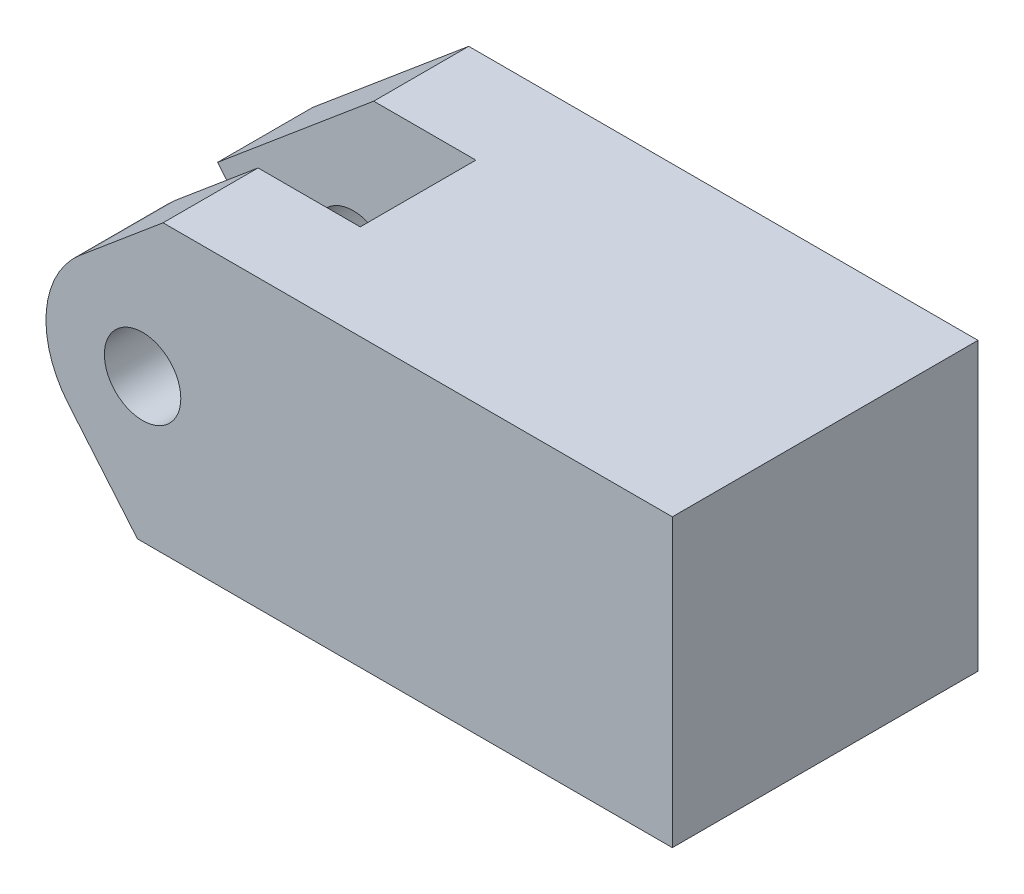
ISO-10303-21;
HEADER;
FILE_DESCRIPTION(('STEP AP214'),'2;1');
FILE_NAME('part.step','',(''),(''),'','','');
FILE_SCHEMA(('AUTOMOTIVE_DESIGN { 1 0 10303 214 1 1 1 1 }'));
ENDSEC;
DATA;
#1=APPLICATION_CONTEXT('core data for automotive mechanical design processes');
#2=APPLICATION_PROTOCOL_DEFINITION('international standard','automotive_design',2000,#1);
#3=PRODUCT_CONTEXT('',#1,'mechanical');
#4=PRODUCT('Part','Part','',(#3));
#5=PRODUCT_RELATED_PRODUCT_CATEGORY('part','',(#4));
#6=PRODUCT_DEFINITION_FORMATION('','',#4);
#7=PRODUCT_DEFINITION_CONTEXT('part definition',#1,'design');
#8=PRODUCT_DEFINITION('design','',#6,#7);
#9=PRODUCT_DEFINITION_SHAPE('','',#8);
#10=(LENGTH_UNIT() NAMED_UNIT(*) SI_UNIT(.MILLI.,.METRE.));
#11=(NAMED_UNIT(*) PLANE_ANGLE_UNIT() SI_UNIT($,.RADIAN.));
#12=(NAMED_UNIT(*) SI_UNIT($,.STERADIAN.) SOLID_ANGLE_UNIT());
#13=UNCERTAINTY_MEASURE_WITH_UNIT(LENGTH_MEASURE(1.E-05),#10,'distance_accuracy_value','');
#14=(GEOMETRIC_REPRESENTATION_CONTEXT(3) GLOBAL_UNCERTAINTY_ASSIGNED_CONTEXT((#13)) GLOBAL_UNIT_ASSIGNED_CONTEXT((#10,
#11,#12)) REPRESENTATION_CONTEXT('',''));
#15=CARTESIAN_POINT('',(0.,0.,0.));
#16=DIRECTION('',(0.,0.,1.));
#17=DIRECTION('',(1.,0.,0.));
#18=AXIS2_PLACEMENT_3D('',#15,#16,#17);
#19=CARTESIAN_POINT('',(17.5,15.,-8.));
#20=DIRECTION('',(-1.,0.,0.));
#21=DIRECTION('',(0.,0.,1.));
#22=AXIS2_PLACEMENT_3D('',#19,#20,#21);
#23=PLANE('',#22);
#24=DIRECTION('',(0.,0.,-1.));
#25=VECTOR('',#24,1.);
#26=CARTESIAN_POINT('',(17.5,0.,-8.));
#27=LINE('',#26,#25);
#28=CARTESIAN_POINT('',(17.5,0.,8.));
#29=VERTEX_POINT('',#28);
#30=CARTESIAN_POINT('',(17.5,0.,-8.));
#31=VERTEX_POINT('',#30);
#32=EDGE_CURVE('E150',#29,#31,#27,.T.);
#33=ORIENTED_EDGE('',*,*,#32,.T.);
#34=DIRECTION('',(0.,-1.,0.));
#35=VECTOR('',#34,1.);
#36=CARTESIAN_POINT('',(17.5,15.,-8.));
#37=LINE('',#36,#35);
#38=CARTESIAN_POINT('',(17.5,15.,-8.));
#39=VERTEX_POINT('',#38);
#40=EDGE_CURVE('E170',#39,#31,#37,.T.);
#41=ORIENTED_EDGE('',*,*,#40,.F.);
#42=DIRECTION('',(0.,0.,-1.));
#43=VECTOR('',#42,1.);
#44=CARTESIAN_POINT('',(17.5,15.,-8.));
#45=LINE('',#44,#43);
#46=CARTESIAN_POINT('',(17.5,15.,8.));
#47=VERTEX_POINT('',#46);
#48=EDGE_CURVE('E152',#47,#39,#45,.T.);
#49=ORIENTED_EDGE('',*,*,#48,.F.);
#50=DIRECTION('',(0.,-1.,0.));
#51=VECTOR('',#50,1.);
#52=CARTESIAN_POINT('',(17.5,15.,8.));
#53=LINE('',#52,#51);
#54=EDGE_CURVE('E161',#47,#29,#53,.T.);
#55=ORIENTED_EDGE('',*,*,#54,.T.);
#56=EDGE_LOOP('',(#33,#41,#49,#55));
#57=FACE_BOUND('',#56,.T.);
#58=ADVANCED_FACE('F31',(#57),#23,.F.);
#59=CARTESIAN_POINT('',(-17.5,15.,-8.));
#60=DIRECTION('',(0.,0.,1.));
#61=DIRECTION('',(1.,0.,0.));
#62=AXIS2_PLACEMENT_3D('',#59,#60,#61);
#63=PLANE('',#62);
#64=CARTESIAN_POINT('',(-10.2298232946794,7.5,-8.));
#65=DIRECTION('',(0.,0.,1.));
#66=DIRECTION('',(1.,0.,0.));
#67=AXIS2_PLACEMENT_3D('',#64,#65,#66);
#68=CIRCLE('',#67,2.);
#69=CARTESIAN_POINT('',(-8.22982329467936,7.5,-8.));
#70=VERTEX_POINT('',#69);
#71=EDGE_CURVE('E178',#70,#70,#68,.T.);
#72=ORIENTED_EDGE('',*,*,#71,.T.);
#73=EDGE_LOOP('',(#72));
#74=FACE_BOUND('',#73,.T.);
#75=DIRECTION('',(-1.,0.,0.));
#76=VECTOR('',#75,1.);
#77=CARTESIAN_POINT('',(-17.5,0.,-8.));
#78=LINE('',#77,#76);
#79=CARTESIAN_POINT('',(-10.5,0.,-8.));
#80=VERTEX_POINT('',#79);
#81=EDGE_CURVE('E164',#31,#80,#78,.T.);
#82=ORIENTED_EDGE('',*,*,#81,.T.);
#83=DIRECTION('',(0.642787609686541,-0.766044443118977,0.));
#84=VECTOR('',#83,1.);
#85=CARTESIAN_POINT('',(-17.5,8.34227514815947,-8.));
#86=LINE('',#85,#84);
#87=CARTESIAN_POINT('',(-17.3314623902146,8.14141984621044,-8.));
#88=VERTEX_POINT('',#87);
#89=EDGE_CURVE('E187',#80,#88,#86,.F.);
#90=ORIENTED_EDGE('',*,*,#89,.T.);
#91=DIRECTION('',(0.766044443118977,0.642787609686541,0.));
#92=VECTOR('',#91,1.);
#93=CARTESIAN_POINT('',(-9.15772485184053,15.,-8.));
#94=LINE('',#93,#92);
#95=CARTESIAN_POINT('',(-9.15772485184053,15.,-8.));
#96=VERTEX_POINT('',#95);
#97=EDGE_CURVE('E185',#88,#96,#94,.T.);
#98=ORIENTED_EDGE('',*,*,#97,.T.);
#99=DIRECTION('',(-1.,0.,0.));
#100=VECTOR('',#99,1.);
#101=CARTESIAN_POINT('',(-17.5,15.,-8.));
#102=LINE('',#101,#100);
#103=EDGE_CURVE('E155',#39,#96,#102,.T.);
#104=ORIENTED_EDGE('',*,*,#103,.F.);
#105=ORIENTED_EDGE('',*,*,#40,.T.);
#106=EDGE_LOOP('',(#82,#90,#98,#104,#105));
#107=FACE_BOUND('',#106,.T.);
#108=ADVANCED_FACE('F230',(#74,#107),#63,.F.);
#109=CARTESIAN_POINT('',(-17.5,15.,8.));
#110=DIRECTION('',(0.,0.,-1.));
#111=DIRECTION('',(-1.,0.,0.));
#112=AXIS2_PLACEMENT_3D('',#109,#110,#111);
#113=PLANE('',#112);
#114=CARTESIAN_POINT('',(-10.2298232946794,7.5,8.));
#115=DIRECTION('',(0.,0.,1.));
#116=DIRECTION('',(1.,0.,0.));
#117=AXIS2_PLACEMENT_3D('',#114,#115,#116);
#118=CIRCLE('',#117,2.);
#119=CARTESIAN_POINT('',(-8.22982329467936,7.5,8.));
#120=VERTEX_POINT('',#119);
#121=EDGE_CURVE('E205',#120,#120,#118,.T.);
#122=ORIENTED_EDGE('',*,*,#121,.F.);
#123=EDGE_LOOP('',(#122));
#124=FACE_BOUND('',#123,.T.);
#125=DIRECTION('',(-0.766044443118977,-0.642787609686541,0.));
#126=VECTOR('',#125,1.);
#127=CARTESIAN_POINT('',(-9.15772485184053,15.,8.));
#128=LINE('',#127,#126);
#129=CARTESIAN_POINT('',(-9.15772485184053,15.,8.));
#130=VERTEX_POINT('',#129);
#131=CARTESIAN_POINT('',(-13.5012401746197,11.3553578946431,8.));
#132=VERTEX_POINT('',#131);
#133=EDGE_CURVE('E189',#130,#132,#128,.T.);
#134=ORIENTED_EDGE('',*,*,#133,.T.);
#135=CARTESIAN_POINT('',(-10.287302126187,7.52513567904825,8.));
#136=DIRECTION('',(0.,0.,-1.));
#137=DIRECTION('',(-1.,0.,0.));
#138=AXIS2_PLACEMENT_3D('',#135,#136,#137);
#139=CIRCLE('',#138,5.);
#140=CARTESIAN_POINT('',(-14.1175243417819,4.31119763061555,8.));
#141=VERTEX_POINT('',#140);
#142=EDGE_CURVE('E11',#132,#141,#139,.F.);
#143=ORIENTED_EDGE('',*,*,#142,.T.);
#144=DIRECTION('',(-0.642787609686541,0.766044443118977,0.));
#145=VECTOR('',#144,1.);
#146=CARTESIAN_POINT('',(-17.5,8.34227514815948,8.));
#147=LINE('',#146,#145);
#148=CARTESIAN_POINT('',(-10.5,0.,8.));
#149=VERTEX_POINT('',#148);
#150=EDGE_CURVE('E191',#141,#149,#147,.F.);
#151=ORIENTED_EDGE('',*,*,#150,.T.);
#152=DIRECTION('',(1.,0.,0.));
#153=VECTOR('',#152,1.);
#154=CARTESIAN_POINT('',(-17.5,0.,8.));
#155=LINE('',#154,#153);
#156=EDGE_CURVE('E156',#149,#29,#155,.T.);
#157=ORIENTED_EDGE('',*,*,#156,.T.);
#158=ORIENTED_EDGE('',*,*,#54,.F.);
#159=DIRECTION('',(1.,0.,0.));
#160=VECTOR('',#159,1.);
#161=CARTESIAN_POINT('',(-17.5,15.,8.));
#162=LINE('',#161,#160);
#163=EDGE_CURVE('E159',#130,#47,#162,.T.);
#164=ORIENTED_EDGE('',*,*,#163,.F.);
#165=EDGE_LOOP('',(#134,#143,#151,#157,#158,#164));
#166=FACE_BOUND('',#165,.T.);
#167=ADVANCED_FACE('F237',(#124,#166),#113,.F.);
#168=CARTESIAN_POINT('',(17.5,15.,8.));
#169=DIRECTION('',(0.,1.,0.));
#170=DIRECTION('',(0.,0.,1.));
#171=AXIS2_PLACEMENT_3D('',#168,#169,#170);
#172=PLANE('',#171);
#173=DIRECTION('',(1.,0.,0.));
#174=VECTOR('',#173,1.);
#175=CARTESIAN_POINT('',(-31.1885194094329,15.,3.0268874387466));
#176=LINE('',#175,#174);
#177=CARTESIAN_POINT('',(-9.15772485184053,15.,3.0268874387466));
#178=VERTEX_POINT('',#177);
#179=CARTESIAN_POINT('',(-3.81148059056713,15.,3.0268874387466));
#180=VERTEX_POINT('',#179);
#181=EDGE_CURVE('E140',#178,#180,#176,.T.);
#182=ORIENTED_EDGE('',*,*,#181,.F.);
#183=DIRECTION('',(0.,0.,1.));
#184=VECTOR('',#183,1.);
#185=CARTESIAN_POINT('',(-9.15772485184053,15.,8.));
#186=LINE('',#185,#184);
#187=EDGE_CURVE('E199',#178,#130,#186,.T.);
#188=ORIENTED_EDGE('',*,*,#187,.T.);
#189=ORIENTED_EDGE('',*,*,#163,.T.);
#190=ORIENTED_EDGE('',*,*,#48,.T.);
#191=ORIENTED_EDGE('',*,*,#103,.T.);
#192=DIRECTION('',(0.,0.,1.));
#193=VECTOR('',#192,1.);
#194=CARTESIAN_POINT('',(-9.15772485184053,15.,-3.0268874387466));
#195=LINE('',#194,#193);
#196=CARTESIAN_POINT('',(-9.15772485184053,15.,-3.0268874387466));
#197=VERTEX_POINT('',#196);
#198=EDGE_CURVE('E197',#96,#197,#195,.T.);
#199=ORIENTED_EDGE('',*,*,#198,.T.);
#200=DIRECTION('',(-1.,0.,0.));
#201=VECTOR('',#200,1.);
#202=CARTESIAN_POINT('',(-31.1885194094329,15.,-3.0268874387466));
#203=LINE('',#202,#201);
#204=CARTESIAN_POINT('',(-3.81148059056713,15.,-3.0268874387466));
#205=VERTEX_POINT('',#204);
#206=EDGE_CURVE('E142',#205,#197,#203,.T.);
#207=ORIENTED_EDGE('',*,*,#206,.F.);
#208=DIRECTION('',(0.,0.,-1.));
#209=VECTOR('',#208,1.);
#210=CARTESIAN_POINT('',(-3.81148059056713,15.,-3.0268874387466));
#211=LINE('',#210,#209);
#212=EDGE_CURVE('E120',#180,#205,#211,.T.);
#213=ORIENTED_EDGE('',*,*,#212,.F.);
#214=EDGE_LOOP('',(#182,#188,#189,#190,#191,#199,#207,#213));
#215=FACE_BOUND('',#214,.T.);
#216=ADVANCED_FACE('F218',(#215),#172,.T.);
#217=CARTESIAN_POINT('',(17.5,0.,8.));
#218=DIRECTION('',(0.,1.,0.));
#219=DIRECTION('',(0.,0.,1.));
#220=AXIS2_PLACEMENT_3D('',#217,#218,#219);
#221=PLANE('',#220);
#222=DIRECTION('',(-1.,0.,0.));
#223=VECTOR('',#222,1.);
#224=CARTESIAN_POINT('',(-31.1885194094329,0.,-3.0268874387466));
#225=LINE('',#224,#223);
#226=CARTESIAN_POINT('',(-3.81148059056713,0.,-3.0268874387466));
#227=VERTEX_POINT('',#226);
#228=CARTESIAN_POINT('',(-10.5,0.,-3.0268874387466));
#229=VERTEX_POINT('',#228);
#230=EDGE_CURVE('E125',#227,#229,#225,.T.);
#231=ORIENTED_EDGE('',*,*,#230,.T.);
#232=DIRECTION('',(0.,0.,-1.));
#233=VECTOR('',#232,1.);
#234=CARTESIAN_POINT('',(-10.5,0.,8.00000000000001));
#235=LINE('',#234,#233);
#236=EDGE_CURVE('E183',#229,#80,#235,.T.);
#237=ORIENTED_EDGE('',*,*,#236,.T.);
#238=ORIENTED_EDGE('',*,*,#81,.F.);
#239=ORIENTED_EDGE('',*,*,#32,.F.);
#240=ORIENTED_EDGE('',*,*,#156,.F.);
#241=DIRECTION('',(0.,0.,-1.));
#242=VECTOR('',#241,1.);
#243=CARTESIAN_POINT('',(-10.5,0.,8.00000000000001));
#244=LINE('',#243,#242);
#245=CARTESIAN_POINT('',(-10.5,0.,3.0268874387466));
#246=VERTEX_POINT('',#245);
#247=EDGE_CURVE('E181',#149,#246,#244,.T.);
#248=ORIENTED_EDGE('',*,*,#247,.T.);
#249=DIRECTION('',(1.,0.,0.));
#250=VECTOR('',#249,1.);
#251=CARTESIAN_POINT('',(17.5,0.,3.0268874387466));
#252=LINE('',#251,#250);
#253=CARTESIAN_POINT('',(-3.81148059056713,0.,3.0268874387466));
#254=VERTEX_POINT('',#253);
#255=EDGE_CURVE('E138',#246,#254,#252,.T.);
#256=ORIENTED_EDGE('',*,*,#255,.T.);
#257=DIRECTION('',(0.,0.,-1.));
#258=VECTOR('',#257,1.);
#259=CARTESIAN_POINT('',(-3.81148059056713,0.,-3.0268874387466));
#260=LINE('',#259,#258);
#261=EDGE_CURVE('E118',#254,#227,#260,.T.);
#262=ORIENTED_EDGE('',*,*,#261,.T.);
#263=EDGE_LOOP('',(#231,#237,#238,#239,#240,#248,#256,#262));
#264=FACE_BOUND('',#263,.T.);
#265=ADVANCED_FACE('F135',(#264),#221,.F.);
#266=CARTESIAN_POINT('',(-31.1885194094329,0.,3.0268874387466));
#267=DIRECTION('',(0.,0.,1.));
#268=DIRECTION('',(1.,0.,0.));
#269=AXIS2_PLACEMENT_3D('',#266,#267,#268);
#270=PLANE('',#269);
#271=CARTESIAN_POINT('',(-10.2298232946794,7.5,3.0268874387466));
#272=DIRECTION('',(0.,0.,1.));
#273=DIRECTION('',(1.,0.,0.));
#274=AXIS2_PLACEMENT_3D('',#271,#272,#273);
#275=CIRCLE('',#274,2.);
#276=CARTESIAN_POINT('',(-8.22982329467936,7.5,3.0268874387466));
#277=VERTEX_POINT('',#276);
#278=EDGE_CURVE('E145',#277,#277,#275,.T.);
#279=ORIENTED_EDGE('',*,*,#278,.T.);
#280=EDGE_LOOP('',(#279));
#281=FACE_BOUND('',#280,.T.);
#282=DIRECTION('',(0.642787609686541,-0.766044443118977,0.));
#283=VECTOR('',#282,1.);
#284=CARTESIAN_POINT('',(-17.5,8.34227514815948,3.0268874387466));
#285=LINE('',#284,#283);
#286=CARTESIAN_POINT('',(-14.1175243417819,4.31119763061555,3.0268874387466));
#287=VERTEX_POINT('',#286);
#288=EDGE_CURVE('E195',#246,#287,#285,.F.);
#289=ORIENTED_EDGE('',*,*,#288,.T.);
#290=CARTESIAN_POINT('',(-10.287302126187,7.52513567904825,3.0268874387466));
#291=DIRECTION('',(0.,0.,1.));
#292=DIRECTION('',(1.,0.,0.));
#293=AXIS2_PLACEMENT_3D('',#290,#291,#292);
#294=CIRCLE('',#293,5.);
#295=CARTESIAN_POINT('',(-13.5012401746197,11.3553578946431,3.0268874387466));
#296=VERTEX_POINT('',#295);
#297=EDGE_CURVE('E53',#287,#296,#294,.F.);
#298=ORIENTED_EDGE('',*,*,#297,.T.);
#299=DIRECTION('',(0.766044443118977,0.642787609686541,0.));
#300=VECTOR('',#299,1.);
#301=CARTESIAN_POINT('',(-9.15772485184053,15.,3.0268874387466));
#302=LINE('',#301,#300);
#303=EDGE_CURVE('E193',#296,#178,#302,.T.);
#304=ORIENTED_EDGE('',*,*,#303,.T.);
#305=ORIENTED_EDGE('',*,*,#181,.T.);
#306=DIRECTION('',(0.,1.,0.));
#307=VECTOR('',#306,1.);
#308=CARTESIAN_POINT('',(-3.81148059056713,0.,3.0268874387466));
#309=LINE('',#308,#307);
#310=EDGE_CURVE('E124',#254,#180,#309,.T.);
#311=ORIENTED_EDGE('',*,*,#310,.F.);
#312=ORIENTED_EDGE('',*,*,#255,.F.);
#313=EDGE_LOOP('',(#289,#298,#304,#305,#311,#312));
#314=FACE_BOUND('',#313,.T.);
#315=ADVANCED_FACE('F215',(#281,#314),#270,.F.);
#316=CARTESIAN_POINT('',(-31.1885194094329,0.,-3.0268874387466));
#317=DIRECTION('',(0.,0.,-1.));
#318=DIRECTION('',(-1.,0.,0.));
#319=AXIS2_PLACEMENT_3D('',#316,#317,#318);
#320=PLANE('',#319);
#321=CARTESIAN_POINT('',(-10.2298232946794,7.5,-3.0268874387466));
#322=DIRECTION('',(0.,0.,-1.));
#323=DIRECTION('',(-1.,0.,0.));
#324=AXIS2_PLACEMENT_3D('',#321,#322,#323);
#325=CIRCLE('',#324,2.);
#326=CARTESIAN_POINT('',(-12.2298232946794,7.5,-3.0268874387466));
#327=VERTEX_POINT('',#326);
#328=EDGE_CURVE('E175',#327,#327,#325,.T.);
#329=ORIENTED_EDGE('',*,*,#328,.T.);
#330=EDGE_LOOP('',(#329));
#331=FACE_BOUND('',#330,.T.);
#332=DIRECTION('',(-0.766044443118977,-0.642787609686541,0.));
#333=VECTOR('',#332,1.);
#334=CARTESIAN_POINT('',(-9.15772485184053,15.,-3.0268874387466));
#335=LINE('',#334,#333);
#336=CARTESIAN_POINT('',(-17.3314623902146,8.14141984621044,-3.0268874387466));
#337=VERTEX_POINT('',#336);
#338=EDGE_CURVE('E174',#197,#337,#335,.T.);
#339=ORIENTED_EDGE('',*,*,#338,.T.);
#340=DIRECTION('',(-0.642787609686541,0.766044443118977,0.));
#341=VECTOR('',#340,1.);
#342=CARTESIAN_POINT('',(-17.5,8.34227514815947,-3.0268874387466));
#343=LINE('',#342,#341);
#344=EDGE_CURVE('E130',#337,#229,#343,.F.);
#345=ORIENTED_EDGE('',*,*,#344,.T.);
#346=ORIENTED_EDGE('',*,*,#230,.F.);
#347=DIRECTION('',(0.,1.,0.));
#348=VECTOR('',#347,1.);
#349=CARTESIAN_POINT('',(-3.81148059056713,0.,-3.0268874387466));
#350=LINE('',#349,#348);
#351=EDGE_CURVE('E113',#227,#205,#350,.T.);
#352=ORIENTED_EDGE('',*,*,#351,.T.);
#353=ORIENTED_EDGE('',*,*,#206,.T.);
#354=EDGE_LOOP('',(#339,#345,#346,#352,#353));
#355=FACE_BOUND('',#354,.T.);
#356=ADVANCED_FACE('F128',(#331,#355),#320,.F.);
#357=CARTESIAN_POINT('',(-3.81148059056713,0.,-3.0268874387466));
#358=DIRECTION('',(1.,0.,0.));
#359=DIRECTION('',(0.,0.,-1.));
#360=AXIS2_PLACEMENT_3D('',#357,#358,#359);
#361=PLANE('',#360);
#362=ORIENTED_EDGE('',*,*,#212,.T.);
#363=ORIENTED_EDGE('',*,*,#351,.F.);
#364=ORIENTED_EDGE('',*,*,#261,.F.);
#365=ORIENTED_EDGE('',*,*,#310,.T.);
#366=EDGE_LOOP('',(#362,#363,#364,#365));
#367=FACE_BOUND('',#366,.T.);
#368=ADVANCED_FACE('F115',(#367),#361,.F.);
#369=CARTESIAN_POINT('',(-10.2298232946794,7.5,-8.));
#370=DIRECTION('',(0.,0.,1.));
#371=DIRECTION('',(1.,0.,0.));
#372=AXIS2_PLACEMENT_3D('',#369,#370,#371);
#373=CYLINDRICAL_SURFACE('',#372,2.);
#374=ORIENTED_EDGE('',*,*,#71,.F.);
#375=EDGE_LOOP('',(#374));
#376=FACE_BOUND('',#375,.T.);
#377=ORIENTED_EDGE('',*,*,#328,.F.);
#378=EDGE_LOOP('',(#377));
#379=FACE_BOUND('',#378,.T.);
#380=ADVANCED_FACE('F296',(#376,#379),#373,.F.);
#381=ORIENTED_EDGE('',*,*,#121,.T.);
#382=EDGE_LOOP('',(#381));
#383=FACE_BOUND('',#382,.T.);
#384=ORIENTED_EDGE('',*,*,#278,.F.);
#385=EDGE_LOOP('',(#384));
#386=FACE_BOUND('',#385,.T.);
#387=ADVANCED_FACE('F258',(#383,#386),#373,.F.);
#388=CARTESIAN_POINT('',(-9.15772485184053,15.,8.00000000000001));
#389=DIRECTION('',(-0.642787609686541,0.766044443118977,0.));
#390=DIRECTION('',(-0.766044443118977,-0.642787609686541,0.));
#391=AXIS2_PLACEMENT_3D('',#388,#389,#390);
#392=PLANE('',#391);
#393=ORIENTED_EDGE('',*,*,#198,.F.);
#394=ORIENTED_EDGE('',*,*,#97,.F.);
#395=DIRECTION('',(0.,0.,1.));
#396=VECTOR('',#395,1.);
#397=CARTESIAN_POINT('',(-17.3314623902146,8.14141984621044,-8.));
#398=LINE('',#397,#396);
#399=EDGE_CURVE('E202',#337,#88,#398,.F.);
#400=ORIENTED_EDGE('',*,*,#399,.F.);
#401=ORIENTED_EDGE('',*,*,#338,.F.);
#402=EDGE_LOOP('',(#393,#394,#400,#401));
#403=FACE_BOUND('',#402,.T.);
#404=ADVANCED_FACE('F224',(#403),#392,.T.);
#405=CARTESIAN_POINT('',(-17.5,8.34227514815947,-8.));
#406=DIRECTION('',(0.766044443118977,0.642787609686541,0.));
#407=DIRECTION('',(-0.642787609686541,0.766044443118977,0.));
#408=AXIS2_PLACEMENT_3D('',#405,#406,#407);
#409=PLANE('',#408);
#410=ORIENTED_EDGE('',*,*,#89,.F.);
#411=ORIENTED_EDGE('',*,*,#236,.F.);
#412=ORIENTED_EDGE('',*,*,#344,.F.);
#413=ORIENTED_EDGE('',*,*,#399,.T.);
#414=EDGE_LOOP('',(#410,#411,#412,#413));
#415=FACE_BOUND('',#414,.T.);
#416=ADVANCED_FACE('F227',(#415),#409,.F.);
#417=CARTESIAN_POINT('',(-9.15772485184053,15.,8.00000000000001));
#418=DIRECTION('',(-0.642787609686541,0.766044443118977,0.));
#419=DIRECTION('',(-0.766044443118977,-0.642787609686541,0.));
#420=AXIS2_PLACEMENT_3D('',#417,#418,#419);
#421=PLANE('',#420);
#422=ORIENTED_EDGE('',*,*,#303,.F.);
#423=DIRECTION('',(0.,0.,1.));
#424=VECTOR('',#423,1.);
#425=CARTESIAN_POINT('',(-13.5012401746197,11.3553578946431,8.00000000000001));
#426=LINE('',#425,#424);
#427=EDGE_CURVE('E39',#296,#132,#426,.T.);
#428=ORIENTED_EDGE('',*,*,#427,.T.);
#429=ORIENTED_EDGE('',*,*,#133,.F.);
#430=ORIENTED_EDGE('',*,*,#187,.F.);
#431=EDGE_LOOP('',(#422,#428,#429,#430));
#432=FACE_BOUND('',#431,.T.);
#433=ADVANCED_FACE('F243',(#432),#421,.T.);
#434=CARTESIAN_POINT('',(-17.5,8.34227514815947,-8.));
#435=DIRECTION('',(0.766044443118977,0.642787609686541,0.));
#436=DIRECTION('',(-0.642787609686541,0.766044443118977,0.));
#437=AXIS2_PLACEMENT_3D('',#434,#435,#436);
#438=PLANE('',#437);
#439=ORIENTED_EDGE('',*,*,#150,.F.);
#440=DIRECTION('',(0.,0.,-1.));
#441=VECTOR('',#440,1.);
#442=CARTESIAN_POINT('',(-14.1175243417819,4.31119763061555,-8.));
#443=LINE('',#442,#441);
#444=EDGE_CURVE('E201',#141,#287,#443,.T.);
#445=ORIENTED_EDGE('',*,*,#444,.T.);
#446=ORIENTED_EDGE('',*,*,#288,.F.);
#447=ORIENTED_EDGE('',*,*,#247,.F.);
#448=EDGE_LOOP('',(#439,#445,#446,#447));
#449=FACE_BOUND('',#448,.T.);
#450=ADVANCED_FACE('F211',(#449),#438,.F.);
#451=CARTESIAN_POINT('',(-10.287302126187,7.52513567904825,-8.));
#452=DIRECTION('',(0.,0.,1.));
#453=DIRECTION('',(1.,0.,0.));
#454=AXIS2_PLACEMENT_3D('',#451,#452,#453);
#455=CYLINDRICAL_SURFACE('',#454,5.);
#456=ORIENTED_EDGE('',*,*,#142,.F.);
#457=ORIENTED_EDGE('',*,*,#427,.F.);
#458=ORIENTED_EDGE('',*,*,#297,.F.);
#459=ORIENTED_EDGE('',*,*,#444,.F.);
#460=EDGE_LOOP('',(#456,#457,#458,#459));
#461=FACE_BOUND('',#460,.T.);
#462=ADVANCED_FACE('F33',(#461),#455,.T.);
#463=CLOSED_SHELL('',(#58,#108,#167,#216,#265,#315,#356,#368,#380,#387,#404,#416,#433,#450,#462));
#464=MANIFOLD_SOLID_BREP('B2',#463);
#465=ADVANCED_BREP_SHAPE_REPRESENTATION('',(#18,#464),#14);
#466=SHAPE_DEFINITION_REPRESENTATION(#9,#465);
ENDSEC;
END-ISO-10303-21;
